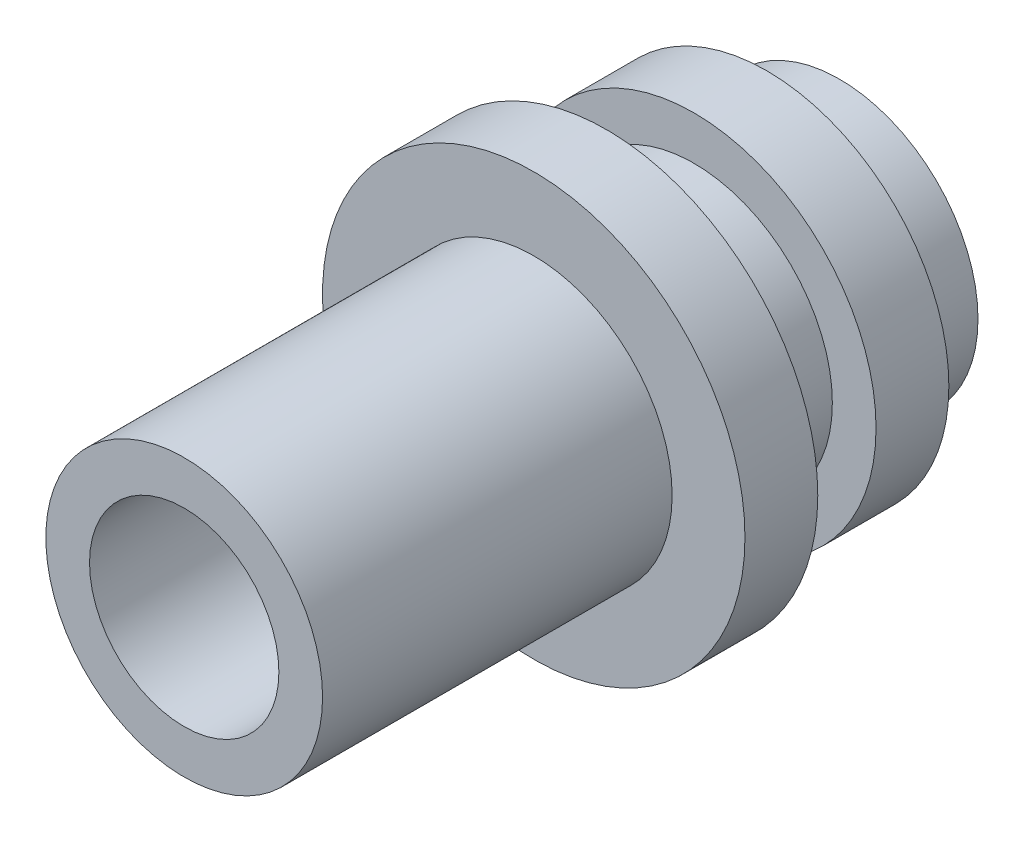
ISO-10303-21;
HEADER;
FILE_DESCRIPTION(('STEP AP214'),'2;1');
FILE_NAME('part.step','',(''),(''),'','','');
FILE_SCHEMA(('AUTOMOTIVE_DESIGN { 1 0 10303 214 1 1 1 1 }'));
ENDSEC;
DATA;
#1=APPLICATION_CONTEXT('core data for automotive mechanical design processes');
#2=APPLICATION_PROTOCOL_DEFINITION('international standard','automotive_design',2000,#1);
#3=PRODUCT_CONTEXT('',#1,'mechanical');
#4=PRODUCT('Part','Part','',(#3));
#5=PRODUCT_RELATED_PRODUCT_CATEGORY('part','',(#4));
#6=PRODUCT_DEFINITION_FORMATION('','',#4);
#7=PRODUCT_DEFINITION_CONTEXT('part definition',#1,'design');
#8=PRODUCT_DEFINITION('design','',#6,#7);
#9=PRODUCT_DEFINITION_SHAPE('','',#8);
#10=(LENGTH_UNIT() NAMED_UNIT(*) SI_UNIT(.MILLI.,.METRE.));
#11=(NAMED_UNIT(*) PLANE_ANGLE_UNIT() SI_UNIT($,.RADIAN.));
#12=(NAMED_UNIT(*) SI_UNIT($,.STERADIAN.) SOLID_ANGLE_UNIT());
#13=UNCERTAINTY_MEASURE_WITH_UNIT(LENGTH_MEASURE(1.E-05),#10,'distance_accuracy_value','');
#14=(GEOMETRIC_REPRESENTATION_CONTEXT(3) GLOBAL_UNCERTAINTY_ASSIGNED_CONTEXT((#13)) GLOBAL_UNIT_ASSIGNED_CONTEXT((#10,
#11,#12)) REPRESENTATION_CONTEXT('',''));
#15=CARTESIAN_POINT('',(0.,0.,0.));
#16=DIRECTION('',(0.,0.,1.));
#17=DIRECTION('',(1.,0.,0.));
#18=AXIS2_PLACEMENT_3D('',#15,#16,#17);
#19=CARTESIAN_POINT('',(0.,0.,2.5));
#20=DIRECTION('',(0.,0.,-1.));
#21=DIRECTION('',(-1.,0.,0.));
#22=AXIS2_PLACEMENT_3D('',#19,#20,#21);
#23=CYLINDRICAL_SURFACE('',#22,7.25);
#24=CARTESIAN_POINT('',(0.,0.,2.5));
#25=DIRECTION('',(0.,0.,1.));
#26=DIRECTION('',(1.,0.,0.));
#27=AXIS2_PLACEMENT_3D('',#24,#25,#26);
#28=CIRCLE('',#27,7.25);
#29=CARTESIAN_POINT('',(7.25,0.,2.5));
#30=VERTEX_POINT('',#29);
#31=EDGE_CURVE('E55',#30,#30,#28,.T.);
#32=ORIENTED_EDGE('',*,*,#31,.F.);
#33=EDGE_LOOP('',(#32));
#34=FACE_BOUND('',#33,.T.);
#35=CARTESIAN_POINT('',(0.,0.,0.));
#36=DIRECTION('',(0.,0.,1.));
#37=DIRECTION('',(1.,0.,0.));
#38=AXIS2_PLACEMENT_3D('',#35,#36,#37);
#39=CIRCLE('',#38,7.25);
#40=CARTESIAN_POINT('',(7.25,0.,0.));
#41=VERTEX_POINT('',#40);
#42=EDGE_CURVE('E54',#41,#41,#39,.T.);
#43=ORIENTED_EDGE('',*,*,#42,.T.);
#44=EDGE_LOOP('',(#43));
#45=FACE_BOUND('',#44,.T.);
#46=ADVANCED_FACE('F41',(#34,#45),#23,.T.);
#47=CARTESIAN_POINT('',(0.,0.,2.5));
#48=DIRECTION('',(0.,0.,1.));
#49=DIRECTION('',(1.,0.,0.));
#50=AXIS2_PLACEMENT_3D('',#47,#48,#49);
#51=PLANE('',#50);
#52=CARTESIAN_POINT('',(0.,0.,2.5));
#53=DIRECTION('',(0.,0.,1.));
#54=DIRECTION('',(1.,0.,0.));
#55=AXIS2_PLACEMENT_3D('',#52,#53,#54);
#56=CIRCLE('',#55,4.75);
#57=CARTESIAN_POINT('',(4.75,0.,2.5));
#58=VERTEX_POINT('',#57);
#59=EDGE_CURVE('E48',#58,#58,#56,.T.);
#60=ORIENTED_EDGE('',*,*,#59,.F.);
#61=EDGE_LOOP('',(#60));
#62=FACE_BOUND('',#61,.T.);
#63=ORIENTED_EDGE('',*,*,#31,.T.);
#64=EDGE_LOOP('',(#63));
#65=FACE_BOUND('',#64,.T.);
#66=ADVANCED_FACE('F102',(#62,#65),#51,.T.);
#67=CARTESIAN_POINT('',(0.,0.,0.));
#68=DIRECTION('',(0.,0.,1.));
#69=DIRECTION('',(1.,0.,0.));
#70=AXIS2_PLACEMENT_3D('',#67,#68,#69);
#71=PLANE('',#70);
#72=CARTESIAN_POINT('',(0.,0.,0.));
#73=DIRECTION('',(0.,0.,1.));
#74=DIRECTION('',(1.,0.,0.));
#75=AXIS2_PLACEMENT_3D('',#72,#73,#74);
#76=CIRCLE('',#75,4.75);
#77=CARTESIAN_POINT('',(4.75,0.,0.));
#78=VERTEX_POINT('',#77);
#79=EDGE_CURVE('E64',#78,#78,#76,.T.);
#80=ORIENTED_EDGE('',*,*,#79,.T.);
#81=EDGE_LOOP('',(#80));
#82=FACE_BOUND('',#81,.T.);
#83=ORIENTED_EDGE('',*,*,#42,.F.);
#84=EDGE_LOOP('',(#83));
#85=FACE_BOUND('',#84,.T.);
#86=ADVANCED_FACE('F103',(#82,#85),#71,.F.);
#87=CARTESIAN_POINT('',(0.,0.,14.5));
#88=DIRECTION('',(0.,0.,-1.));
#89=DIRECTION('',(-1.,0.,0.));
#90=AXIS2_PLACEMENT_3D('',#87,#88,#89);
#91=CYLINDRICAL_SURFACE('',#90,4.75);
#92=CARTESIAN_POINT('',(0.,0.,14.5));
#93=DIRECTION('',(0.,0.,1.));
#94=DIRECTION('',(1.,0.,0.));
#95=AXIS2_PLACEMENT_3D('',#92,#93,#94);
#96=CIRCLE('',#95,4.75);
#97=CARTESIAN_POINT('',(4.75,0.,14.5));
#98=VERTEX_POINT('',#97);
#99=EDGE_CURVE('E59',#98,#98,#96,.T.);
#100=ORIENTED_EDGE('',*,*,#99,.F.);
#101=EDGE_LOOP('',(#100));
#102=FACE_BOUND('',#101,.T.);
#103=ORIENTED_EDGE('',*,*,#59,.T.);
#104=EDGE_LOOP('',(#103));
#105=FACE_BOUND('',#104,.T.);
#106=ADVANCED_FACE('F95',(#102,#105),#91,.T.);
#107=CARTESIAN_POINT('',(0.,0.,14.5));
#108=DIRECTION('',(0.,0.,1.));
#109=DIRECTION('',(1.,0.,0.));
#110=AXIS2_PLACEMENT_3D('',#107,#108,#109);
#111=PLANE('',#110);
#112=CARTESIAN_POINT('',(0.,0.,14.5));
#113=DIRECTION('',(0.,0.,1.));
#114=DIRECTION('',(1.,0.,0.));
#115=AXIS2_PLACEMENT_3D('',#112,#113,#114);
#116=CIRCLE('',#115,3.25);
#117=CARTESIAN_POINT('',(3.25,0.,14.5));
#118=VERTEX_POINT('',#117);
#119=EDGE_CURVE('E77',#118,#118,#116,.T.);
#120=ORIENTED_EDGE('',*,*,#119,.F.);
#121=EDGE_LOOP('',(#120));
#122=FACE_BOUND('',#121,.T.);
#123=ORIENTED_EDGE('',*,*,#99,.T.);
#124=EDGE_LOOP('',(#123));
#125=FACE_BOUND('',#124,.T.);
#126=ADVANCED_FACE('F91',(#122,#125),#111,.T.);
#127=CARTESIAN_POINT('',(0.,0.,0.));
#128=DIRECTION('',(0.,0.,-1.));
#129=DIRECTION('',(-1.,0.,0.));
#130=AXIS2_PLACEMENT_3D('',#127,#128,#129);
#131=CYLINDRICAL_SURFACE('',#130,4.75);
#132=CARTESIAN_POINT('',(0.,0.,-3.));
#133=DIRECTION('',(0.,0.,1.));
#134=DIRECTION('',(1.,0.,0.));
#135=AXIS2_PLACEMENT_3D('',#132,#133,#134);
#136=CIRCLE('',#135,4.75);
#137=CARTESIAN_POINT('',(4.75,0.,-3.));
#138=VERTEX_POINT('',#137);
#139=EDGE_CURVE('E42',#138,#138,#136,.T.);
#140=ORIENTED_EDGE('',*,*,#139,.T.);
#141=EDGE_LOOP('',(#140));
#142=FACE_BOUND('',#141,.T.);
#143=ORIENTED_EDGE('',*,*,#79,.F.);
#144=EDGE_LOOP('',(#143));
#145=FACE_BOUND('',#144,.T.);
#146=ADVANCED_FACE('F93',(#142,#145),#131,.T.);
#147=CARTESIAN_POINT('',(0.,0.,-3.));
#148=DIRECTION('',(0.,0.,-1.));
#149=DIRECTION('',(-1.,0.,0.));
#150=AXIS2_PLACEMENT_3D('',#147,#148,#149);
#151=CYLINDRICAL_SURFACE('',#150,6.25);
#152=CARTESIAN_POINT('',(0.,0.,-3.));
#153=DIRECTION('',(0.,0.,1.));
#154=DIRECTION('',(1.,0.,0.));
#155=AXIS2_PLACEMENT_3D('',#152,#153,#154);
#156=CIRCLE('',#155,6.25);
#157=CARTESIAN_POINT('',(6.25,0.,-3.));
#158=VERTEX_POINT('',#157);
#159=EDGE_CURVE('E72',#158,#158,#156,.T.);
#160=ORIENTED_EDGE('',*,*,#159,.F.);
#161=EDGE_LOOP('',(#160));
#162=FACE_BOUND('',#161,.T.);
#163=CARTESIAN_POINT('',(0.,0.,-5.5));
#164=DIRECTION('',(0.,0.,1.));
#165=DIRECTION('',(1.,0.,0.));
#166=AXIS2_PLACEMENT_3D('',#163,#164,#165);
#167=CIRCLE('',#166,6.25);
#168=CARTESIAN_POINT('',(6.25,0.,-5.5));
#169=VERTEX_POINT('',#168);
#170=EDGE_CURVE('E67',#169,#169,#167,.T.);
#171=ORIENTED_EDGE('',*,*,#170,.T.);
#172=EDGE_LOOP('',(#171));
#173=FACE_BOUND('',#172,.T.);
#174=ADVANCED_FACE('F124',(#162,#173),#151,.T.);
#175=CARTESIAN_POINT('',(0.,0.,-3.));
#176=DIRECTION('',(0.,0.,1.));
#177=DIRECTION('',(1.,0.,0.));
#178=AXIS2_PLACEMENT_3D('',#175,#176,#177);
#179=PLANE('',#178);
#180=ORIENTED_EDGE('',*,*,#139,.F.);
#181=EDGE_LOOP('',(#180));
#182=FACE_BOUND('',#181,.T.);
#183=ORIENTED_EDGE('',*,*,#159,.T.);
#184=EDGE_LOOP('',(#183));
#185=FACE_BOUND('',#184,.T.);
#186=ADVANCED_FACE('F131',(#182,#185),#179,.T.);
#187=CARTESIAN_POINT('',(0.,0.,-5.5));
#188=DIRECTION('',(0.,0.,1.));
#189=DIRECTION('',(1.,0.,0.));
#190=AXIS2_PLACEMENT_3D('',#187,#188,#189);
#191=PLANE('',#190);
#192=CARTESIAN_POINT('',(0.,0.,-5.5));
#193=DIRECTION('',(0.,0.,1.));
#194=DIRECTION('',(1.,0.,0.));
#195=AXIS2_PLACEMENT_3D('',#192,#193,#194);
#196=CIRCLE('',#195,4.75);
#197=CARTESIAN_POINT('',(4.75,0.,-5.5));
#198=VERTEX_POINT('',#197);
#199=EDGE_CURVE('E10',#198,#198,#196,.T.);
#200=ORIENTED_EDGE('',*,*,#199,.T.);
#201=EDGE_LOOP('',(#200));
#202=FACE_BOUND('',#201,.T.);
#203=ORIENTED_EDGE('',*,*,#170,.F.);
#204=EDGE_LOOP('',(#203));
#205=FACE_BOUND('',#204,.T.);
#206=ADVANCED_FACE('F130',(#202,#205),#191,.F.);
#207=CARTESIAN_POINT('',(0.,0.,-8.));
#208=DIRECTION('',(0.,0.,1.));
#209=DIRECTION('',(1.,0.,0.));
#210=AXIS2_PLACEMENT_3D('',#207,#208,#209);
#211=PLANE('',#210);
#212=CARTESIAN_POINT('',(0.,0.,-8.));
#213=DIRECTION('',(0.,0.,1.));
#214=DIRECTION('',(1.,0.,0.));
#215=AXIS2_PLACEMENT_3D('',#212,#213,#214);
#216=CIRCLE('',#215,4.75);
#217=CARTESIAN_POINT('',(4.75,0.,-8.));
#218=VERTEX_POINT('',#217);
#219=EDGE_CURVE('E61',#218,#218,#216,.T.);
#220=ORIENTED_EDGE('',*,*,#219,.F.);
#221=EDGE_LOOP('',(#220));
#222=FACE_BOUND('',#221,.T.);
#223=ADVANCED_FACE('F123',(#222),#211,.F.);
#224=ORIENTED_EDGE('',*,*,#219,.T.);
#225=EDGE_LOOP('',(#224));
#226=FACE_BOUND('',#225,.T.);
#227=ORIENTED_EDGE('',*,*,#199,.F.);
#228=EDGE_LOOP('',(#227));
#229=FACE_BOUND('',#228,.T.);
#230=ADVANCED_FACE('F90',(#226,#229),#131,.T.);
#231=CARTESIAN_POINT('',(0.,0.,6.5));
#232=DIRECTION('',(0.,0.,1.));
#233=DIRECTION('',(1.,0.,0.));
#234=AXIS2_PLACEMENT_3D('',#231,#232,#233);
#235=CYLINDRICAL_SURFACE('',#234,3.25);
#236=CARTESIAN_POINT('',(0.,0.,6.5));
#237=DIRECTION('',(0.,0.,1.));
#238=DIRECTION('',(1.,0.,0.));
#239=AXIS2_PLACEMENT_3D('',#236,#237,#238);
#240=CIRCLE('',#239,3.25);
#241=CARTESIAN_POINT('',(3.25,0.,6.5));
#242=VERTEX_POINT('',#241);
#243=EDGE_CURVE('E74',#242,#242,#240,.T.);
#244=ORIENTED_EDGE('',*,*,#243,.F.);
#245=EDGE_LOOP('',(#244));
#246=FACE_BOUND('',#245,.T.);
#247=ORIENTED_EDGE('',*,*,#119,.T.);
#248=EDGE_LOOP('',(#247));
#249=FACE_BOUND('',#248,.T.);
#250=ADVANCED_FACE('F81',(#246,#249),#235,.F.);
#251=CARTESIAN_POINT('',(0.,0.,6.5));
#252=DIRECTION('',(0.,0.,1.));
#253=DIRECTION('',(1.,0.,0.));
#254=AXIS2_PLACEMENT_3D('',#251,#252,#253);
#255=PLANE('',#254);
#256=ORIENTED_EDGE('',*,*,#243,.T.);
#257=EDGE_LOOP('',(#256));
#258=FACE_BOUND('',#257,.T.);
#259=ADVANCED_FACE('F85',(#258),#255,.T.);
#260=CLOSED_SHELL('',(#46,#66,#86,#106,#126,#146,#174,#186,#206,#223,#230,#250,#259));
#261=MANIFOLD_SOLID_BREP('B2',#260);
#262=ADVANCED_BREP_SHAPE_REPRESENTATION('',(#18,#261),#14);
#263=SHAPE_DEFINITION_REPRESENTATION(#9,#262);
ENDSEC;
END-ISO-10303-21;
